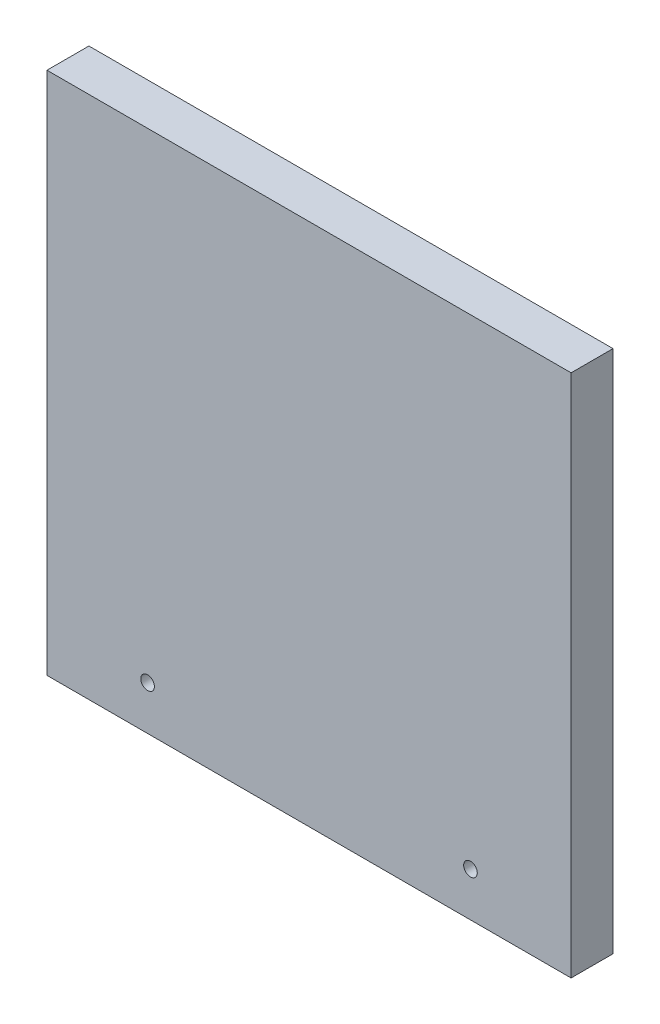
ISO-10303-21;
HEADER;
FILE_DESCRIPTION(('STEP AP214'),'2;1');
FILE_NAME('part.step','',(''),(''),'','','');
FILE_SCHEMA(('AUTOMOTIVE_DESIGN { 1 0 10303 214 1 1 1 1 }'));
ENDSEC;
DATA;
#1=APPLICATION_CONTEXT('core data for automotive mechanical design processes');
#2=APPLICATION_PROTOCOL_DEFINITION('international standard','automotive_design',2000,#1);
#3=PRODUCT_CONTEXT('',#1,'mechanical');
#4=PRODUCT('Part','Part','',(#3));
#5=PRODUCT_RELATED_PRODUCT_CATEGORY('part','',(#4));
#6=PRODUCT_DEFINITION_FORMATION('','',#4);
#7=PRODUCT_DEFINITION_CONTEXT('part definition',#1,'design');
#8=PRODUCT_DEFINITION('design','',#6,#7);
#9=PRODUCT_DEFINITION_SHAPE('','',#8);
#10=(LENGTH_UNIT() NAMED_UNIT(*) SI_UNIT(.MILLI.,.METRE.));
#11=(NAMED_UNIT(*) PLANE_ANGLE_UNIT() SI_UNIT($,.RADIAN.));
#12=(NAMED_UNIT(*) SI_UNIT($,.STERADIAN.) SOLID_ANGLE_UNIT());
#13=UNCERTAINTY_MEASURE_WITH_UNIT(LENGTH_MEASURE(1.E-05),#10,'distance_accuracy_value','');
#14=(GEOMETRIC_REPRESENTATION_CONTEXT(3) GLOBAL_UNCERTAINTY_ASSIGNED_CONTEXT((#13)) GLOBAL_UNIT_ASSIGNED_CONTEXT((#10,
#11,#12)) REPRESENTATION_CONTEXT('',''));
#15=CARTESIAN_POINT('',(0.,0.,0.));
#16=DIRECTION('',(0.,0.,1.));
#17=DIRECTION('',(1.,0.,0.));
#18=AXIS2_PLACEMENT_3D('',#15,#16,#17);
#19=CARTESIAN_POINT('',(125.,250.,-195.6));
#20=DIRECTION('',(-1.,0.,0.));
#21=DIRECTION('',(0.,0.,1.));
#22=AXIS2_PLACEMENT_3D('',#19,#20,#21);
#23=PLANE('',#22);
#24=DIRECTION('',(0.,0.,-1.));
#25=VECTOR('',#24,1.);
#26=CARTESIAN_POINT('',(125.,0.,-195.6));
#27=LINE('',#26,#25);
#28=CARTESIAN_POINT('',(125.,0.,-175.6));
#29=VERTEX_POINT('',#28);
#30=CARTESIAN_POINT('',(125.,0.,-195.6));
#31=VERTEX_POINT('',#30);
#32=EDGE_CURVE('E96',#29,#31,#27,.T.);
#33=ORIENTED_EDGE('',*,*,#32,.T.);
#34=DIRECTION('',(0.,-1.,0.));
#35=VECTOR('',#34,1.);
#36=CARTESIAN_POINT('',(125.,250.,-195.6));
#37=LINE('',#36,#35);
#38=CARTESIAN_POINT('',(125.,250.,-195.6));
#39=VERTEX_POINT('',#38);
#40=EDGE_CURVE('E11',#39,#31,#37,.T.);
#41=ORIENTED_EDGE('',*,*,#40,.F.);
#42=DIRECTION('',(0.,0.,-1.));
#43=VECTOR('',#42,1.);
#44=CARTESIAN_POINT('',(125.,250.,-195.6));
#45=LINE('',#44,#43);
#46=CARTESIAN_POINT('',(125.,250.,-175.6));
#47=VERTEX_POINT('',#46);
#48=EDGE_CURVE('E84',#47,#39,#45,.T.);
#49=ORIENTED_EDGE('',*,*,#48,.F.);
#50=DIRECTION('',(0.,-1.,0.));
#51=VECTOR('',#50,1.);
#52=CARTESIAN_POINT('',(125.,250.,-175.6));
#53=LINE('',#52,#51);
#54=EDGE_CURVE('E92',#47,#29,#53,.T.);
#55=ORIENTED_EDGE('',*,*,#54,.T.);
#56=EDGE_LOOP('',(#33,#41,#49,#55));
#57=FACE_BOUND('',#56,.T.);
#58=ADVANCED_FACE('F33',(#57),#23,.F.);
#59=CARTESIAN_POINT('',(-125.,250.,-195.6));
#60=DIRECTION('',(0.,0.,1.));
#61=DIRECTION('',(1.,0.,0.));
#62=AXIS2_PLACEMENT_3D('',#59,#60,#61);
#63=PLANE('',#62);
#64=CARTESIAN_POINT('',(-77.,21.,-195.6));
#65=DIRECTION('',(0.,0.,1.));
#66=DIRECTION('',(1.,0.,0.));
#67=AXIS2_PLACEMENT_3D('',#64,#65,#66);
#68=CIRCLE('',#67,3.25000000000001);
#69=CARTESIAN_POINT('',(-73.75,21.,-195.6));
#70=VERTEX_POINT('',#69);
#71=EDGE_CURVE('E99',#70,#70,#68,.T.);
#72=ORIENTED_EDGE('',*,*,#71,.T.);
#73=EDGE_LOOP('',(#72));
#74=FACE_BOUND('',#73,.T.);
#75=CARTESIAN_POINT('',(77.,21.,-195.6));
#76=DIRECTION('',(0.,0.,1.));
#77=DIRECTION('',(-1.,0.,0.));
#78=AXIS2_PLACEMENT_3D('',#75,#76,#77);
#79=CIRCLE('',#78,3.25000000000001);
#80=CARTESIAN_POINT('',(73.75,21.,-195.6));
#81=VERTEX_POINT('',#80);
#82=EDGE_CURVE('E113',#81,#81,#79,.T.);
#83=ORIENTED_EDGE('',*,*,#82,.T.);
#84=EDGE_LOOP('',(#83));
#85=FACE_BOUND('',#84,.T.);
#86=DIRECTION('',(-1.,0.,0.));
#87=VECTOR('',#86,1.);
#88=CARTESIAN_POINT('',(-125.,0.,-195.6));
#89=LINE('',#88,#87);
#90=CARTESIAN_POINT('',(-125.,0.,-195.6));
#91=VERTEX_POINT('',#90);
#92=EDGE_CURVE('E88',#31,#91,#89,.T.);
#93=ORIENTED_EDGE('',*,*,#92,.T.);
#94=DIRECTION('',(0.,-1.,0.));
#95=VECTOR('',#94,1.);
#96=CARTESIAN_POINT('',(-125.,250.,-195.6));
#97=LINE('',#96,#95);
#98=CARTESIAN_POINT('',(-125.,250.,-195.6));
#99=VERTEX_POINT('',#98);
#100=EDGE_CURVE('E41',#99,#91,#97,.T.);
#101=ORIENTED_EDGE('',*,*,#100,.F.);
#102=DIRECTION('',(-1.,0.,0.));
#103=VECTOR('',#102,1.);
#104=CARTESIAN_POINT('',(-125.,250.,-195.6));
#105=LINE('',#104,#103);
#106=EDGE_CURVE('E79',#39,#99,#105,.T.);
#107=ORIENTED_EDGE('',*,*,#106,.F.);
#108=ORIENTED_EDGE('',*,*,#40,.T.);
#109=EDGE_LOOP('',(#93,#101,#107,#108));
#110=FACE_BOUND('',#109,.T.);
#111=ADVANCED_FACE('F87',(#74,#85,#110),#63,.F.);
#112=CARTESIAN_POINT('',(-125.,250.,-195.6));
#113=DIRECTION('',(1.,0.,0.));
#114=DIRECTION('',(0.,0.,-1.));
#115=AXIS2_PLACEMENT_3D('',#112,#113,#114);
#116=PLANE('',#115);
#117=DIRECTION('',(0.,0.,1.));
#118=VECTOR('',#117,1.);
#119=CARTESIAN_POINT('',(-125.,0.,-195.6));
#120=LINE('',#119,#118);
#121=CARTESIAN_POINT('',(-125.,0.,-175.6));
#122=VERTEX_POINT('',#121);
#123=EDGE_CURVE('E66',#91,#122,#120,.T.);
#124=ORIENTED_EDGE('',*,*,#123,.T.);
#125=DIRECTION('',(0.,-1.,0.));
#126=VECTOR('',#125,1.);
#127=CARTESIAN_POINT('',(-125.,250.,-175.6));
#128=LINE('',#127,#126);
#129=CARTESIAN_POINT('',(-125.,250.,-175.6));
#130=VERTEX_POINT('',#129);
#131=EDGE_CURVE('E89',#130,#122,#128,.T.);
#132=ORIENTED_EDGE('',*,*,#131,.F.);
#133=DIRECTION('',(0.,0.,1.));
#134=VECTOR('',#133,1.);
#135=CARTESIAN_POINT('',(-125.,250.,-195.6));
#136=LINE('',#135,#134);
#137=EDGE_CURVE('E82',#99,#130,#136,.T.);
#138=ORIENTED_EDGE('',*,*,#137,.F.);
#139=ORIENTED_EDGE('',*,*,#100,.T.);
#140=EDGE_LOOP('',(#124,#132,#138,#139));
#141=FACE_BOUND('',#140,.T.);
#142=ADVANCED_FACE('F90',(#141),#116,.F.);
#143=CARTESIAN_POINT('',(-125.,250.,-175.6));
#144=DIRECTION('',(0.,0.,-1.));
#145=DIRECTION('',(-1.,0.,0.));
#146=AXIS2_PLACEMENT_3D('',#143,#144,#145);
#147=PLANE('',#146);
#148=CARTESIAN_POINT('',(-77.,21.,-175.6));
#149=DIRECTION('',(0.,0.,1.));
#150=DIRECTION('',(1.,0.,0.));
#151=AXIS2_PLACEMENT_3D('',#148,#149,#150);
#152=CIRCLE('',#151,3.25000000000001);
#153=CARTESIAN_POINT('',(-73.75,21.,-175.6));
#154=VERTEX_POINT('',#153);
#155=EDGE_CURVE('E116',#154,#154,#152,.T.);
#156=ORIENTED_EDGE('',*,*,#155,.F.);
#157=EDGE_LOOP('',(#156));
#158=FACE_BOUND('',#157,.T.);
#159=CARTESIAN_POINT('',(77.,21.,-175.6));
#160=DIRECTION('',(0.,0.,1.));
#161=DIRECTION('',(-1.,0.,0.));
#162=AXIS2_PLACEMENT_3D('',#159,#160,#161);
#163=CIRCLE('',#162,3.25000000000001);
#164=CARTESIAN_POINT('',(73.75,21.,-175.6));
#165=VERTEX_POINT('',#164);
#166=EDGE_CURVE('E110',#165,#165,#163,.T.);
#167=ORIENTED_EDGE('',*,*,#166,.F.);
#168=EDGE_LOOP('',(#167));
#169=FACE_BOUND('',#168,.T.);
#170=DIRECTION('',(1.,0.,0.));
#171=VECTOR('',#170,1.);
#172=CARTESIAN_POINT('',(-125.,0.,-175.6));
#173=LINE('',#172,#171);
#174=EDGE_CURVE('E72',#122,#29,#173,.T.);
#175=ORIENTED_EDGE('',*,*,#174,.T.);
#176=ORIENTED_EDGE('',*,*,#54,.F.);
#177=DIRECTION('',(1.,0.,0.));
#178=VECTOR('',#177,1.);
#179=CARTESIAN_POINT('',(-125.,250.,-175.6));
#180=LINE('',#179,#178);
#181=EDGE_CURVE('E49',#130,#47,#180,.T.);
#182=ORIENTED_EDGE('',*,*,#181,.F.);
#183=ORIENTED_EDGE('',*,*,#131,.T.);
#184=EDGE_LOOP('',(#175,#176,#182,#183));
#185=FACE_BOUND('',#184,.T.);
#186=ADVANCED_FACE('F104',(#158,#169,#185),#147,.F.);
#187=CARTESIAN_POINT('',(0.,250.,0.));
#188=DIRECTION('',(0.,1.,0.));
#189=DIRECTION('',(0.,0.,1.));
#190=AXIS2_PLACEMENT_3D('',#187,#188,#189);
#191=PLANE('',#190);
#192=ORIENTED_EDGE('',*,*,#48,.T.);
#193=ORIENTED_EDGE('',*,*,#106,.T.);
#194=ORIENTED_EDGE('',*,*,#137,.T.);
#195=ORIENTED_EDGE('',*,*,#181,.T.);
#196=EDGE_LOOP('',(#192,#193,#194,#195));
#197=FACE_BOUND('',#196,.T.);
#198=ADVANCED_FACE('F80',(#197),#191,.T.);
#199=CARTESIAN_POINT('',(0.,0.,0.));
#200=DIRECTION('',(0.,1.,0.));
#201=DIRECTION('',(0.,0.,1.));
#202=AXIS2_PLACEMENT_3D('',#199,#200,#201);
#203=PLANE('',#202);
#204=ORIENTED_EDGE('',*,*,#32,.F.);
#205=ORIENTED_EDGE('',*,*,#174,.F.);
#206=ORIENTED_EDGE('',*,*,#123,.F.);
#207=ORIENTED_EDGE('',*,*,#92,.F.);
#208=EDGE_LOOP('',(#204,#205,#206,#207));
#209=FACE_BOUND('',#208,.T.);
#210=ADVANCED_FACE('F107',(#209),#203,.F.);
#211=CARTESIAN_POINT('',(77.,21.,-195.6));
#212=DIRECTION('',(0.,0.,1.));
#213=DIRECTION('',(1.,0.,0.));
#214=AXIS2_PLACEMENT_3D('',#211,#212,#213);
#215=CYLINDRICAL_SURFACE('',#214,3.25000000000001);
#216=ORIENTED_EDGE('',*,*,#82,.F.);
#217=EDGE_LOOP('',(#216));
#218=FACE_BOUND('',#217,.T.);
#219=ORIENTED_EDGE('',*,*,#166,.T.);
#220=EDGE_LOOP('',(#219));
#221=FACE_BOUND('',#220,.T.);
#222=ADVANCED_FACE('F127',(#218,#221),#215,.F.);
#223=CARTESIAN_POINT('',(-77.,21.,-195.6));
#224=DIRECTION('',(0.,0.,1.));
#225=DIRECTION('',(1.,0.,0.));
#226=AXIS2_PLACEMENT_3D('',#223,#224,#225);
#227=CYLINDRICAL_SURFACE('',#226,3.25000000000001);
#228=ORIENTED_EDGE('',*,*,#71,.F.);
#229=EDGE_LOOP('',(#228));
#230=FACE_BOUND('',#229,.T.);
#231=ORIENTED_EDGE('',*,*,#155,.T.);
#232=EDGE_LOOP('',(#231));
#233=FACE_BOUND('',#232,.T.);
#234=ADVANCED_FACE('F124',(#230,#233),#227,.F.);
#235=CLOSED_SHELL('',(#58,#111,#142,#186,#198,#210,#222,#234));
#236=MANIFOLD_SOLID_BREP('B2',#235);
#237=ADVANCED_BREP_SHAPE_REPRESENTATION('',(#18,#236),#14);
#238=SHAPE_DEFINITION_REPRESENTATION(#9,#237);
ENDSEC;
END-ISO-10303-21;
